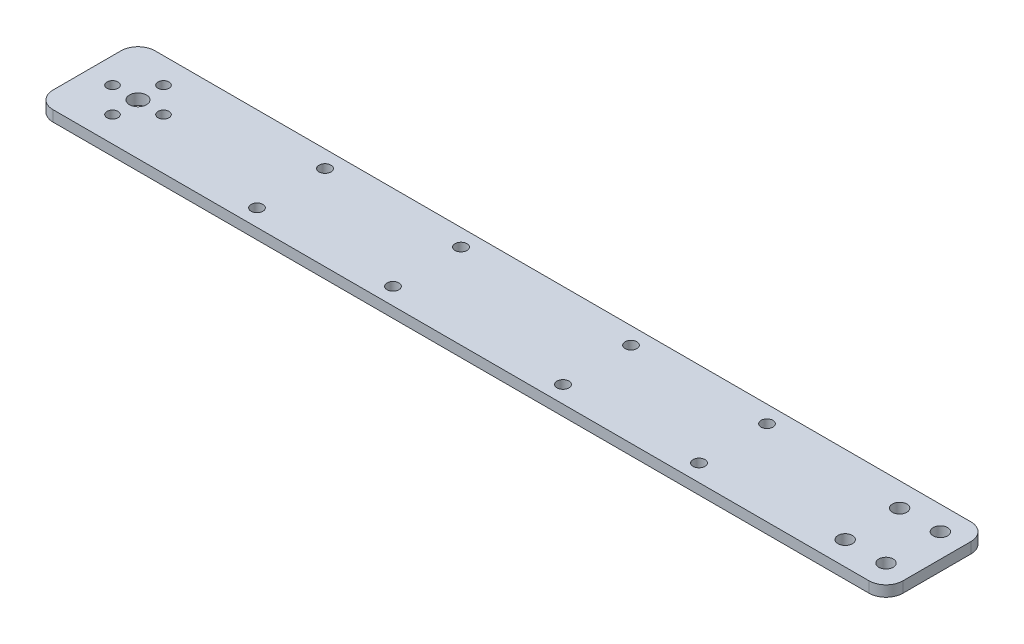
ISO-10303-21;
HEADER;
FILE_DESCRIPTION(('STEP AP214'),'2;1');
FILE_NAME('part.step','',(''),(''),'','','');
FILE_SCHEMA(('AUTOMOTIVE_DESIGN { 1 0 10303 214 1 1 1 1 }'));
ENDSEC;
DATA;
#1=APPLICATION_CONTEXT('core data for automotive mechanical design processes');
#2=APPLICATION_PROTOCOL_DEFINITION('international standard','automotive_design',2000,#1);
#3=PRODUCT_CONTEXT('',#1,'mechanical');
#4=PRODUCT('Part','Part','',(#3));
#5=PRODUCT_RELATED_PRODUCT_CATEGORY('part','',(#4));
#6=PRODUCT_DEFINITION_FORMATION('','',#4);
#7=PRODUCT_DEFINITION_CONTEXT('part definition',#1,'design');
#8=PRODUCT_DEFINITION('design','',#6,#7);
#9=PRODUCT_DEFINITION_SHAPE('','',#8);
#10=(LENGTH_UNIT() NAMED_UNIT(*) SI_UNIT(.MILLI.,.METRE.));
#11=(NAMED_UNIT(*) PLANE_ANGLE_UNIT() SI_UNIT($,.RADIAN.));
#12=(NAMED_UNIT(*) SI_UNIT($,.STERADIAN.) SOLID_ANGLE_UNIT());
#13=UNCERTAINTY_MEASURE_WITH_UNIT(LENGTH_MEASURE(1.E-05),#10,'distance_accuracy_value','');
#14=(GEOMETRIC_REPRESENTATION_CONTEXT(3) GLOBAL_UNCERTAINTY_ASSIGNED_CONTEXT((#13)) GLOBAL_UNIT_ASSIGNED_CONTEXT((#10,
#11,#12)) REPRESENTATION_CONTEXT('',''));
#15=CARTESIAN_POINT('',(0.,0.,0.));
#16=DIRECTION('',(0.,0.,1.));
#17=DIRECTION('',(1.,0.,0.));
#18=AXIS2_PLACEMENT_3D('',#15,#16,#17);
#19=CARTESIAN_POINT('',(-15.,3.175,-15.));
#20=DIRECTION('',(1.,0.,0.));
#21=DIRECTION('',(0.,0.,-1.));
#22=AXIS2_PLACEMENT_3D('',#19,#20,#21);
#23=PLANE('',#22);
#24=DIRECTION('',(0.,0.,1.));
#25=VECTOR('',#24,1.);
#26=CARTESIAN_POINT('',(-15.,3.175,-15.));
#27=LINE('',#26,#25);
#28=CARTESIAN_POINT('',(-15.,3.175,-10.));
#29=VERTEX_POINT('',#28);
#30=CARTESIAN_POINT('',(-15.,3.175,10.));
#31=VERTEX_POINT('',#30);
#32=EDGE_CURVE('E131',#29,#31,#27,.T.);
#33=ORIENTED_EDGE('',*,*,#32,.F.);
#34=DIRECTION('',(0.,-1.,0.));
#35=VECTOR('',#34,1.);
#36=CARTESIAN_POINT('',(-15.,3.175,-10.));
#37=LINE('',#36,#35);
#38=CARTESIAN_POINT('',(-15.,0.,-10.));
#39=VERTEX_POINT('',#38);
#40=EDGE_CURVE('E11',#29,#39,#37,.T.);
#41=ORIENTED_EDGE('',*,*,#40,.T.);
#42=DIRECTION('',(0.,0.,1.));
#43=VECTOR('',#42,1.);
#44=CARTESIAN_POINT('',(-15.,0.,-15.));
#45=LINE('',#44,#43);
#46=CARTESIAN_POINT('',(-15.,0.,10.));
#47=VERTEX_POINT('',#46);
#48=EDGE_CURVE('E133',#39,#47,#45,.T.);
#49=ORIENTED_EDGE('',*,*,#48,.T.);
#50=DIRECTION('',(0.,-1.,0.));
#51=VECTOR('',#50,1.);
#52=CARTESIAN_POINT('',(-15.,3.175,10.));
#53=LINE('',#52,#51);
#54=EDGE_CURVE('E43',#47,#31,#53,.F.);
#55=ORIENTED_EDGE('',*,*,#54,.T.);
#56=EDGE_LOOP('',(#33,#41,#49,#55));
#57=FACE_BOUND('',#56,.T.);
#58=ADVANCED_FACE('F34',(#57),#23,.F.);
#59=CARTESIAN_POINT('',(-15.,3.175,15.));
#60=DIRECTION('',(0.,0.,-1.));
#61=DIRECTION('',(-1.,0.,0.));
#62=AXIS2_PLACEMENT_3D('',#59,#60,#61);
#63=PLANE('',#62);
#64=DIRECTION('',(1.,0.,0.));
#65=VECTOR('',#64,1.);
#66=CARTESIAN_POINT('',(-15.,0.,15.));
#67=LINE('',#66,#65);
#68=CARTESIAN_POINT('',(-9.99999999999999,0.,15.));
#69=VERTEX_POINT('',#68);
#70=CARTESIAN_POINT('',(230.,0.,15.));
#71=VERTEX_POINT('',#70);
#72=EDGE_CURVE('E129',#69,#71,#67,.T.);
#73=ORIENTED_EDGE('',*,*,#72,.T.);
#74=DIRECTION('',(0.,-1.,0.));
#75=VECTOR('',#74,1.);
#76=CARTESIAN_POINT('',(230.,3.175,15.));
#77=LINE('',#76,#75);
#78=CARTESIAN_POINT('',(230.,3.175,15.));
#79=VERTEX_POINT('',#78);
#80=EDGE_CURVE('E108',#71,#79,#77,.F.);
#81=ORIENTED_EDGE('',*,*,#80,.T.);
#82=DIRECTION('',(1.,0.,0.));
#83=VECTOR('',#82,1.);
#84=CARTESIAN_POINT('',(-15.,3.175,15.));
#85=LINE('',#84,#83);
#86=CARTESIAN_POINT('',(-9.99999999999999,3.175,15.));
#87=VERTEX_POINT('',#86);
#88=EDGE_CURVE('E203',#87,#79,#85,.T.);
#89=ORIENTED_EDGE('',*,*,#88,.F.);
#90=DIRECTION('',(0.,-1.,0.));
#91=VECTOR('',#90,1.);
#92=CARTESIAN_POINT('',(-9.99999999999999,3.175,15.));
#93=LINE('',#92,#91);
#94=EDGE_CURVE('E113',#87,#69,#93,.T.);
#95=ORIENTED_EDGE('',*,*,#94,.T.);
#96=EDGE_LOOP('',(#73,#81,#89,#95));
#97=FACE_BOUND('',#96,.T.);
#98=ADVANCED_FACE('F219',(#97),#63,.F.);
#99=CARTESIAN_POINT('',(235.,3.175,-15.));
#100=DIRECTION('',(-1.,0.,0.));
#101=DIRECTION('',(0.,0.,1.));
#102=AXIS2_PLACEMENT_3D('',#99,#100,#101);
#103=PLANE('',#102);
#104=DIRECTION('',(0.,0.,-1.));
#105=VECTOR('',#104,1.);
#106=CARTESIAN_POINT('',(235.,3.175,-15.));
#107=LINE('',#106,#105);
#108=CARTESIAN_POINT('',(235.,3.175,10.));
#109=VERTEX_POINT('',#108);
#110=CARTESIAN_POINT('',(235.,3.175,-10.));
#111=VERTEX_POINT('',#110);
#112=EDGE_CURVE('E122',#109,#111,#107,.T.);
#113=ORIENTED_EDGE('',*,*,#112,.F.);
#114=DIRECTION('',(0.,-1.,0.));
#115=VECTOR('',#114,1.);
#116=CARTESIAN_POINT('',(235.,3.175,10.));
#117=LINE('',#116,#115);
#118=CARTESIAN_POINT('',(235.,0.,10.));
#119=VERTEX_POINT('',#118);
#120=EDGE_CURVE('E107',#109,#119,#117,.T.);
#121=ORIENTED_EDGE('',*,*,#120,.T.);
#122=DIRECTION('',(0.,0.,-1.));
#123=VECTOR('',#122,1.);
#124=CARTESIAN_POINT('',(235.,0.,-15.));
#125=LINE('',#124,#123);
#126=CARTESIAN_POINT('',(235.,0.,-10.));
#127=VERTEX_POINT('',#126);
#128=EDGE_CURVE('E120',#119,#127,#125,.T.);
#129=ORIENTED_EDGE('',*,*,#128,.T.);
#130=DIRECTION('',(0.,-1.,0.));
#131=VECTOR('',#130,1.);
#132=CARTESIAN_POINT('',(235.,3.175,-10.));
#133=LINE('',#132,#131);
#134=EDGE_CURVE('E124',#127,#111,#133,.F.);
#135=ORIENTED_EDGE('',*,*,#134,.T.);
#136=EDGE_LOOP('',(#113,#121,#129,#135));
#137=FACE_BOUND('',#136,.T.);
#138=ADVANCED_FACE('F119',(#137),#103,.F.);
#139=CARTESIAN_POINT('',(-15.,3.175,-15.));
#140=DIRECTION('',(0.,0.,1.));
#141=DIRECTION('',(1.,0.,0.));
#142=AXIS2_PLACEMENT_3D('',#139,#140,#141);
#143=PLANE('',#142);
#144=DIRECTION('',(-1.,0.,0.));
#145=VECTOR('',#144,1.);
#146=CARTESIAN_POINT('',(-15.,3.175,-15.));
#147=LINE('',#146,#145);
#148=CARTESIAN_POINT('',(230.,3.175,-15.));
#149=VERTEX_POINT('',#148);
#150=CARTESIAN_POINT('',(-9.99999999999999,3.175,-15.));
#151=VERTEX_POINT('',#150);
#152=EDGE_CURVE('E137',#149,#151,#147,.T.);
#153=ORIENTED_EDGE('',*,*,#152,.F.);
#154=DIRECTION('',(0.,-1.,0.));
#155=VECTOR('',#154,1.);
#156=CARTESIAN_POINT('',(230.,3.175,-15.));
#157=LINE('',#156,#155);
#158=CARTESIAN_POINT('',(230.,0.,-15.));
#159=VERTEX_POINT('',#158);
#160=EDGE_CURVE('E154',#149,#159,#157,.T.);
#161=ORIENTED_EDGE('',*,*,#160,.T.);
#162=DIRECTION('',(-1.,0.,0.));
#163=VECTOR('',#162,1.);
#164=CARTESIAN_POINT('',(-15.,0.,-15.));
#165=LINE('',#164,#163);
#166=CARTESIAN_POINT('',(-9.99999999999999,0.,-15.));
#167=VERTEX_POINT('',#166);
#168=EDGE_CURVE('E128',#159,#167,#165,.T.);
#169=ORIENTED_EDGE('',*,*,#168,.T.);
#170=DIRECTION('',(0.,-1.,0.));
#171=VECTOR('',#170,1.);
#172=CARTESIAN_POINT('',(-9.99999999999999,3.175,-15.));
#173=LINE('',#172,#171);
#174=EDGE_CURVE('E51',#167,#151,#173,.F.);
#175=ORIENTED_EDGE('',*,*,#174,.T.);
#176=EDGE_LOOP('',(#153,#161,#169,#175));
#177=FACE_BOUND('',#176,.T.);
#178=ADVANCED_FACE('F226',(#177),#143,.F.);
#179=CARTESIAN_POINT('',(0.,3.175,0.));
#180=DIRECTION('',(0.,1.,0.));
#181=DIRECTION('',(0.,0.,1.));
#182=AXIS2_PLACEMENT_3D('',#179,#180,#181);
#183=PLANE('',#182);
#184=CARTESIAN_POINT('',(216.,3.175,7.99999999999999));
#185=DIRECTION('',(0.,1.,0.));
#186=DIRECTION('',(0.,0.,-1.));
#187=AXIS2_PLACEMENT_3D('',#184,#185,#186);
#188=CIRCLE('',#187,2.12499999999998);
#189=CARTESIAN_POINT('',(216.,3.175,5.87500000000002));
#190=VERTEX_POINT('',#189);
#191=EDGE_CURVE('E344',#190,#190,#188,.T.);
#192=ORIENTED_EDGE('',*,*,#191,.F.);
#193=EDGE_LOOP('',(#192));
#194=FACE_BOUND('',#193,.T.);
#195=CARTESIAN_POINT('',(228.,3.175,7.99999999999999));
#196=DIRECTION('',(0.,1.,0.));
#197=DIRECTION('',(0.,0.,1.));
#198=AXIS2_PLACEMENT_3D('',#195,#196,#197);
#199=CIRCLE('',#198,2.12499999999998);
#200=CARTESIAN_POINT('',(228.,3.175,10.125));
#201=VERTEX_POINT('',#200);
#202=EDGE_CURVE('E336',#201,#201,#199,.T.);
#203=ORIENTED_EDGE('',*,*,#202,.F.);
#204=EDGE_LOOP('',(#203));
#205=FACE_BOUND('',#204,.T.);
#206=CARTESIAN_POINT('',(228.,3.175,-8.00000000000001));
#207=DIRECTION('',(0.,1.,0.));
#208=DIRECTION('',(0.,0.,-1.));
#209=AXIS2_PLACEMENT_3D('',#206,#207,#208);
#210=CIRCLE('',#209,2.12499999999998);
#211=CARTESIAN_POINT('',(228.,3.175,-10.125));
#212=VERTEX_POINT('',#211);
#213=EDGE_CURVE('E329',#212,#212,#210,.T.);
#214=ORIENTED_EDGE('',*,*,#213,.F.);
#215=EDGE_LOOP('',(#214));
#216=FACE_BOUND('',#215,.T.);
#217=CARTESIAN_POINT('',(216.,3.175,-8.00000000000001));
#218=DIRECTION('',(0.,1.,0.));
#219=DIRECTION('',(0.,0.,1.));
#220=AXIS2_PLACEMENT_3D('',#217,#218,#219);
#221=CIRCLE('',#220,2.12499999999998);
#222=CARTESIAN_POINT('',(216.,3.175,-5.87500000000003));
#223=VERTEX_POINT('',#222);
#224=EDGE_CURVE('E333',#223,#223,#221,.T.);
#225=ORIENTED_EDGE('',*,*,#224,.F.);
#226=EDGE_LOOP('',(#225));
#227=FACE_BOUND('',#226,.T.);
#228=CARTESIAN_POINT('',(175.,3.175,9.99999999999999));
#229=DIRECTION('',(0.,1.,0.));
#230=DIRECTION('',(0.,0.,1.));
#231=AXIS2_PLACEMENT_3D('',#228,#229,#230);
#232=CIRCLE('',#231,1.75000000000001);
#233=CARTESIAN_POINT('',(175.,3.175,11.75));
#234=VERTEX_POINT('',#233);
#235=EDGE_CURVE('E359',#234,#234,#232,.T.);
#236=ORIENTED_EDGE('',*,*,#235,.F.);
#237=EDGE_LOOP('',(#236));
#238=FACE_BOUND('',#237,.T.);
#239=CARTESIAN_POINT('',(85.,3.175,-9.99999999999999));
#240=DIRECTION('',(0.,1.,0.));
#241=DIRECTION('',(0.,0.,-1.));
#242=AXIS2_PLACEMENT_3D('',#239,#240,#241);
#243=CIRCLE('',#242,1.75);
#244=CARTESIAN_POINT('',(85.,3.175,-11.75));
#245=VERTEX_POINT('',#244);
#246=EDGE_CURVE('E362',#245,#245,#243,.T.);
#247=ORIENTED_EDGE('',*,*,#246,.F.);
#248=EDGE_LOOP('',(#247));
#249=FACE_BOUND('',#248,.T.);
#250=CARTESIAN_POINT('',(135.,3.175,-9.99999999999999));
#251=DIRECTION('',(0.,1.,0.));
#252=DIRECTION('',(0.,0.,1.));
#253=AXIS2_PLACEMENT_3D('',#250,#251,#252);
#254=CIRCLE('',#253,1.75000000000001);
#255=CARTESIAN_POINT('',(135.,3.175,-8.24999999999998));
#256=VERTEX_POINT('',#255);
#257=EDGE_CURVE('E365',#256,#256,#254,.T.);
#258=ORIENTED_EDGE('',*,*,#257,.F.);
#259=EDGE_LOOP('',(#258));
#260=FACE_BOUND('',#259,.T.);
#261=CARTESIAN_POINT('',(135.,3.175,9.99999999999999));
#262=DIRECTION('',(0.,1.,0.));
#263=DIRECTION('',(0.,0.,-1.));
#264=AXIS2_PLACEMENT_3D('',#261,#262,#263);
#265=CIRCLE('',#264,1.75000000000001);
#266=CARTESIAN_POINT('',(135.,3.175,8.24999999999998));
#267=VERTEX_POINT('',#266);
#268=EDGE_CURVE('E368',#267,#267,#265,.T.);
#269=ORIENTED_EDGE('',*,*,#268,.F.);
#270=EDGE_LOOP('',(#269));
#271=FACE_BOUND('',#270,.T.);
#272=CARTESIAN_POINT('',(45.,3.175,-9.99999999999999));
#273=DIRECTION('',(0.,1.,0.));
#274=DIRECTION('',(0.,0.,1.));
#275=AXIS2_PLACEMENT_3D('',#272,#273,#274);
#276=CIRCLE('',#275,1.75000000000001);
#277=CARTESIAN_POINT('',(45.,3.175,-8.24999999999998));
#278=VERTEX_POINT('',#277);
#279=EDGE_CURVE('E350',#278,#278,#276,.T.);
#280=ORIENTED_EDGE('',*,*,#279,.F.);
#281=EDGE_LOOP('',(#280));
#282=FACE_BOUND('',#281,.T.);
#283=CARTESIAN_POINT('',(45.,3.175,9.99999999999999));
#284=DIRECTION('',(0.,1.,0.));
#285=DIRECTION('',(0.,0.,-1.));
#286=AXIS2_PLACEMENT_3D('',#283,#284,#285);
#287=CIRCLE('',#286,1.75000000000001);
#288=CARTESIAN_POINT('',(45.,3.175,8.24999999999998));
#289=VERTEX_POINT('',#288);
#290=EDGE_CURVE('E355',#289,#289,#287,.T.);
#291=ORIENTED_EDGE('',*,*,#290,.F.);
#292=EDGE_LOOP('',(#291));
#293=FACE_BOUND('',#292,.T.);
#294=CARTESIAN_POINT('',(175.,3.175,-9.99999999999999));
#295=DIRECTION('',(0.,1.,0.));
#296=DIRECTION('',(0.,0.,-1.));
#297=AXIS2_PLACEMENT_3D('',#294,#295,#296);
#298=CIRCLE('',#297,1.75000000000001);
#299=CARTESIAN_POINT('',(175.,3.175,-11.75));
#300=VERTEX_POINT('',#299);
#301=EDGE_CURVE('E356',#300,#300,#298,.T.);
#302=ORIENTED_EDGE('',*,*,#301,.F.);
#303=EDGE_LOOP('',(#302));
#304=FACE_BOUND('',#303,.T.);
#305=CARTESIAN_POINT('',(85.,3.175,9.99999999999999));
#306=DIRECTION('',(0.,1.,0.));
#307=DIRECTION('',(0.,0.,1.));
#308=AXIS2_PLACEMENT_3D('',#305,#306,#307);
#309=CIRCLE('',#308,1.75);
#310=CARTESIAN_POINT('',(85.,3.175,11.75));
#311=VERTEX_POINT('',#310);
#312=EDGE_CURVE('E162',#311,#311,#309,.T.);
#313=ORIENTED_EDGE('',*,*,#312,.F.);
#314=EDGE_LOOP('',(#313));
#315=FACE_BOUND('',#314,.T.);
#316=CARTESIAN_POINT('',(7.5,3.175,0.));
#317=DIRECTION('',(0.,1.,0.));
#318=DIRECTION('',(0.,0.,1.));
#319=AXIS2_PLACEMENT_3D('',#316,#317,#318);
#320=CIRCLE('',#319,1.625);
#321=CARTESIAN_POINT('',(7.5,3.175,1.625));
#322=VERTEX_POINT('',#321);
#323=EDGE_CURVE('E377',#322,#322,#320,.T.);
#324=ORIENTED_EDGE('',*,*,#323,.F.);
#325=EDGE_LOOP('',(#324));
#326=FACE_BOUND('',#325,.T.);
#327=CARTESIAN_POINT('',(0.,3.175,7.5));
#328=DIRECTION('',(0.,1.,0.));
#329=DIRECTION('',(0.,0.,1.));
#330=AXIS2_PLACEMENT_3D('',#327,#328,#329);
#331=CIRCLE('',#330,1.625);
#332=CARTESIAN_POINT('',(0.,3.175,9.125));
#333=VERTEX_POINT('',#332);
#334=EDGE_CURVE('E383',#333,#333,#331,.T.);
#335=ORIENTED_EDGE('',*,*,#334,.F.);
#336=EDGE_LOOP('',(#335));
#337=FACE_BOUND('',#336,.T.);
#338=CARTESIAN_POINT('',(-7.5,3.175,0.));
#339=DIRECTION('',(0.,1.,0.));
#340=DIRECTION('',(0.,0.,1.));
#341=AXIS2_PLACEMENT_3D('',#338,#339,#340);
#342=CIRCLE('',#341,1.625);
#343=CARTESIAN_POINT('',(-7.5,3.175,1.62499999999995));
#344=VERTEX_POINT('',#343);
#345=EDGE_CURVE('E190',#344,#344,#342,.T.);
#346=ORIENTED_EDGE('',*,*,#345,.F.);
#347=EDGE_LOOP('',(#346));
#348=FACE_BOUND('',#347,.T.);
#349=CARTESIAN_POINT('',(0.,3.175,-7.5));
#350=DIRECTION('',(0.,1.,0.));
#351=DIRECTION('',(0.,0.,1.));
#352=AXIS2_PLACEMENT_3D('',#349,#350,#351);
#353=CIRCLE('',#352,1.625);
#354=CARTESIAN_POINT('',(0.,3.175,-5.875));
#355=VERTEX_POINT('',#354);
#356=EDGE_CURVE('E181',#355,#355,#353,.T.);
#357=ORIENTED_EDGE('',*,*,#356,.F.);
#358=EDGE_LOOP('',(#357));
#359=FACE_BOUND('',#358,.T.);
#360=CARTESIAN_POINT('',(0.,3.175,0.));
#361=DIRECTION('',(0.,1.,0.));
#362=DIRECTION('',(0.,0.,1.));
#363=AXIS2_PLACEMENT_3D('',#360,#361,#362);
#364=CIRCLE('',#363,2.5);
#365=CARTESIAN_POINT('',(0.,3.175,2.5));
#366=VERTEX_POINT('',#365);
#367=EDGE_CURVE('E197',#366,#366,#364,.T.);
#368=ORIENTED_EDGE('',*,*,#367,.F.);
#369=EDGE_LOOP('',(#368));
#370=FACE_BOUND('',#369,.T.);
#371=ORIENTED_EDGE('',*,*,#88,.T.);
#372=CARTESIAN_POINT('',(230.,3.175,10.));
#373=DIRECTION('',(0.,1.,0.));
#374=DIRECTION('',(0.,0.,1.));
#375=AXIS2_PLACEMENT_3D('',#372,#373,#374);
#376=CIRCLE('',#375,5.);
#377=EDGE_CURVE('E151',#79,#109,#376,.T.);
#378=ORIENTED_EDGE('',*,*,#377,.T.);
#379=ORIENTED_EDGE('',*,*,#112,.T.);
#380=CARTESIAN_POINT('',(230.,3.175,-10.));
#381=DIRECTION('',(0.,1.,0.));
#382=DIRECTION('',(0.,0.,1.));
#383=AXIS2_PLACEMENT_3D('',#380,#381,#382);
#384=CIRCLE('',#383,5.);
#385=EDGE_CURVE('E58',#111,#149,#384,.T.);
#386=ORIENTED_EDGE('',*,*,#385,.T.);
#387=ORIENTED_EDGE('',*,*,#152,.T.);
#388=CARTESIAN_POINT('',(-9.99999999999999,3.175,-10.));
#389=DIRECTION('',(0.,1.,0.));
#390=DIRECTION('',(0.,0.,1.));
#391=AXIS2_PLACEMENT_3D('',#388,#389,#390);
#392=CIRCLE('',#391,5.);
#393=EDGE_CURVE('E148',#151,#29,#392,.T.);
#394=ORIENTED_EDGE('',*,*,#393,.T.);
#395=ORIENTED_EDGE('',*,*,#32,.T.);
#396=CARTESIAN_POINT('',(-9.99999999999999,3.175,10.));
#397=DIRECTION('',(0.,1.,0.));
#398=DIRECTION('',(0.,0.,1.));
#399=AXIS2_PLACEMENT_3D('',#396,#397,#398);
#400=CIRCLE('',#399,5.);
#401=EDGE_CURVE('E146',#31,#87,#400,.T.);
#402=ORIENTED_EDGE('',*,*,#401,.T.);
#403=EDGE_LOOP('',(#371,#378,#379,#386,#387,#394,#395,#402));
#404=FACE_BOUND('',#403,.T.);
#405=ADVANCED_FACE('F217',(#194,#205,#216,#227,#238,#249,#260,#271,#282,#293,#304,#315,#326,
#337,#348,#359,#370,#404),#183,.T.);
#406=CARTESIAN_POINT('',(0.,0.,0.));
#407=DIRECTION('',(0.,1.,0.));
#408=DIRECTION('',(0.,0.,1.));
#409=AXIS2_PLACEMENT_3D('',#406,#407,#408);
#410=PLANE('',#409);
#411=CARTESIAN_POINT('',(216.,0.,7.99999999999999));
#412=DIRECTION('',(0.,1.,0.));
#413=DIRECTION('',(0.,0.,-1.));
#414=AXIS2_PLACEMENT_3D('',#411,#412,#413);
#415=CIRCLE('',#414,2.12499999999998);
#416=CARTESIAN_POINT('',(216.,0.,5.87500000000002));
#417=VERTEX_POINT('',#416);
#418=EDGE_CURVE('E341',#417,#417,#415,.T.);
#419=ORIENTED_EDGE('',*,*,#418,.T.);
#420=EDGE_LOOP('',(#419));
#421=FACE_BOUND('',#420,.T.);
#422=CARTESIAN_POINT('',(228.,0.,7.99999999999999));
#423=DIRECTION('',(0.,1.,0.));
#424=DIRECTION('',(0.,0.,1.));
#425=AXIS2_PLACEMENT_3D('',#422,#423,#424);
#426=CIRCLE('',#425,2.12499999999998);
#427=CARTESIAN_POINT('',(228.,0.,10.125));
#428=VERTEX_POINT('',#427);
#429=EDGE_CURVE('E331',#428,#428,#426,.T.);
#430=ORIENTED_EDGE('',*,*,#429,.T.);
#431=EDGE_LOOP('',(#430));
#432=FACE_BOUND('',#431,.T.);
#433=CARTESIAN_POINT('',(228.,0.,-8.00000000000001));
#434=DIRECTION('',(0.,1.,0.));
#435=DIRECTION('',(0.,0.,-1.));
#436=AXIS2_PLACEMENT_3D('',#433,#434,#435);
#437=CIRCLE('',#436,2.12499999999998);
#438=CARTESIAN_POINT('',(228.,0.,-10.125));
#439=VERTEX_POINT('',#438);
#440=EDGE_CURVE('E326',#439,#439,#437,.T.);
#441=ORIENTED_EDGE('',*,*,#440,.T.);
#442=EDGE_LOOP('',(#441));
#443=FACE_BOUND('',#442,.T.);
#444=CARTESIAN_POINT('',(216.,0.,-8.00000000000001));
#445=DIRECTION('',(0.,1.,0.));
#446=DIRECTION('',(0.,0.,1.));
#447=AXIS2_PLACEMENT_3D('',#444,#445,#446);
#448=CIRCLE('',#447,2.12499999999998);
#449=CARTESIAN_POINT('',(216.,0.,-5.87500000000003));
#450=VERTEX_POINT('',#449);
#451=EDGE_CURVE('E347',#450,#450,#448,.T.);
#452=ORIENTED_EDGE('',*,*,#451,.T.);
#453=EDGE_LOOP('',(#452));
#454=FACE_BOUND('',#453,.T.);
#455=CARTESIAN_POINT('',(175.,0.,9.99999999999999));
#456=DIRECTION('',(0.,1.,0.));
#457=DIRECTION('',(0.,0.,1.));
#458=AXIS2_PLACEMENT_3D('',#455,#456,#457);
#459=CIRCLE('',#458,1.75000000000001);
#460=CARTESIAN_POINT('',(175.,0.,11.75));
#461=VERTEX_POINT('',#460);
#462=EDGE_CURVE('E38',#461,#461,#459,.T.);
#463=ORIENTED_EDGE('',*,*,#462,.T.);
#464=EDGE_LOOP('',(#463));
#465=FACE_BOUND('',#464,.T.);
#466=CARTESIAN_POINT('',(85.,0.,-9.99999999999999));
#467=DIRECTION('',(0.,1.,0.));
#468=DIRECTION('',(0.,0.,1.));
#469=AXIS2_PLACEMENT_3D('',#466,#467,#468);
#470=CIRCLE('',#469,1.75);
#471=CARTESIAN_POINT('',(85.,0.,-8.25));
#472=VERTEX_POINT('',#471);
#473=EDGE_CURVE('E176',#472,#472,#470,.T.);
#474=ORIENTED_EDGE('',*,*,#473,.T.);
#475=EDGE_LOOP('',(#474));
#476=FACE_BOUND('',#475,.T.);
#477=CARTESIAN_POINT('',(135.,0.,-9.99999999999999));
#478=DIRECTION('',(0.,1.,0.));
#479=DIRECTION('',(0.,0.,1.));
#480=AXIS2_PLACEMENT_3D('',#477,#478,#479);
#481=CIRCLE('',#480,1.75000000000001);
#482=CARTESIAN_POINT('',(135.,0.,-8.24999999999998));
#483=VERTEX_POINT('',#482);
#484=EDGE_CURVE('E174',#483,#483,#481,.T.);
#485=ORIENTED_EDGE('',*,*,#484,.T.);
#486=EDGE_LOOP('',(#485));
#487=FACE_BOUND('',#486,.T.);
#488=CARTESIAN_POINT('',(135.,0.,9.99999999999999));
#489=DIRECTION('',(0.,1.,0.));
#490=DIRECTION('',(0.,0.,1.));
#491=AXIS2_PLACEMENT_3D('',#488,#489,#490);
#492=CIRCLE('',#491,1.75000000000001);
#493=CARTESIAN_POINT('',(135.,0.,11.75));
#494=VERTEX_POINT('',#493);
#495=EDGE_CURVE('E171',#494,#494,#492,.T.);
#496=ORIENTED_EDGE('',*,*,#495,.T.);
#497=EDGE_LOOP('',(#496));
#498=FACE_BOUND('',#497,.T.);
#499=CARTESIAN_POINT('',(45.,0.,-9.99999999999999));
#500=DIRECTION('',(0.,1.,0.));
#501=DIRECTION('',(0.,0.,1.));
#502=AXIS2_PLACEMENT_3D('',#499,#500,#501);
#503=CIRCLE('',#502,1.75000000000001);
#504=CARTESIAN_POINT('',(45.,0.,-8.24999999999998));
#505=VERTEX_POINT('',#504);
#506=EDGE_CURVE('E168',#505,#505,#503,.T.);
#507=ORIENTED_EDGE('',*,*,#506,.T.);
#508=EDGE_LOOP('',(#507));
#509=FACE_BOUND('',#508,.T.);
#510=CARTESIAN_POINT('',(45.,0.,9.99999999999999));
#511=DIRECTION('',(0.,1.,0.));
#512=DIRECTION('',(0.,0.,1.));
#513=AXIS2_PLACEMENT_3D('',#510,#511,#512);
#514=CIRCLE('',#513,1.75000000000001);
#515=CARTESIAN_POINT('',(45.,0.,11.75));
#516=VERTEX_POINT('',#515);
#517=EDGE_CURVE('E165',#516,#516,#514,.T.);
#518=ORIENTED_EDGE('',*,*,#517,.T.);
#519=EDGE_LOOP('',(#518));
#520=FACE_BOUND('',#519,.T.);
#521=CARTESIAN_POINT('',(175.,0.,-9.99999999999999));
#522=DIRECTION('',(0.,1.,0.));
#523=DIRECTION('',(0.,0.,1.));
#524=AXIS2_PLACEMENT_3D('',#521,#522,#523);
#525=CIRCLE('',#524,1.75000000000001);
#526=CARTESIAN_POINT('',(175.,0.,-8.24999999999998));
#527=VERTEX_POINT('',#526);
#528=EDGE_CURVE('E161',#527,#527,#525,.T.);
#529=ORIENTED_EDGE('',*,*,#528,.T.);
#530=EDGE_LOOP('',(#529));
#531=FACE_BOUND('',#530,.T.);
#532=CARTESIAN_POINT('',(85.,0.,9.99999999999999));
#533=DIRECTION('',(0.,1.,0.));
#534=DIRECTION('',(0.,0.,1.));
#535=AXIS2_PLACEMENT_3D('',#532,#533,#534);
#536=CIRCLE('',#535,1.75);
#537=CARTESIAN_POINT('',(85.,0.,11.75));
#538=VERTEX_POINT('',#537);
#539=EDGE_CURVE('E158',#538,#538,#536,.T.);
#540=ORIENTED_EDGE('',*,*,#539,.T.);
#541=EDGE_LOOP('',(#540));
#542=FACE_BOUND('',#541,.T.);
#543=CARTESIAN_POINT('',(7.5,0.,0.));
#544=DIRECTION('',(0.,1.,0.));
#545=DIRECTION('',(0.,0.,1.));
#546=AXIS2_PLACEMENT_3D('',#543,#544,#545);
#547=CIRCLE('',#546,1.625);
#548=CARTESIAN_POINT('',(7.5,0.,1.625));
#549=VERTEX_POINT('',#548);
#550=EDGE_CURVE('E200',#549,#549,#547,.T.);
#551=ORIENTED_EDGE('',*,*,#550,.T.);
#552=EDGE_LOOP('',(#551));
#553=FACE_BOUND('',#552,.T.);
#554=CARTESIAN_POINT('',(0.,0.,7.5));
#555=DIRECTION('',(0.,1.,0.));
#556=DIRECTION('',(0.,0.,1.));
#557=AXIS2_PLACEMENT_3D('',#554,#555,#556);
#558=CIRCLE('',#557,1.625);
#559=CARTESIAN_POINT('',(0.,0.,9.125));
#560=VERTEX_POINT('',#559);
#561=EDGE_CURVE('E380',#560,#560,#558,.T.);
#562=ORIENTED_EDGE('',*,*,#561,.T.);
#563=EDGE_LOOP('',(#562));
#564=FACE_BOUND('',#563,.T.);
#565=CARTESIAN_POINT('',(-7.5,0.,0.));
#566=DIRECTION('',(0.,1.,0.));
#567=DIRECTION('',(0.,0.,1.));
#568=AXIS2_PLACEMENT_3D('',#565,#566,#567);
#569=CIRCLE('',#568,1.625);
#570=CARTESIAN_POINT('',(-7.5,0.,1.62499999999995));
#571=VERTEX_POINT('',#570);
#572=EDGE_CURVE('E386',#571,#571,#569,.T.);
#573=ORIENTED_EDGE('',*,*,#572,.T.);
#574=EDGE_LOOP('',(#573));
#575=FACE_BOUND('',#574,.T.);
#576=CARTESIAN_POINT('',(0.,0.,-7.5));
#577=DIRECTION('',(0.,1.,0.));
#578=DIRECTION('',(0.,0.,1.));
#579=AXIS2_PLACEMENT_3D('',#576,#577,#578);
#580=CIRCLE('',#579,1.625);
#581=CARTESIAN_POINT('',(0.,0.,-5.875));
#582=VERTEX_POINT('',#581);
#583=EDGE_CURVE('E185',#582,#582,#580,.T.);
#584=ORIENTED_EDGE('',*,*,#583,.T.);
#585=EDGE_LOOP('',(#584));
#586=FACE_BOUND('',#585,.T.);
#587=CARTESIAN_POINT('',(0.,0.,0.));
#588=DIRECTION('',(0.,1.,0.));
#589=DIRECTION('',(0.,0.,1.));
#590=AXIS2_PLACEMENT_3D('',#587,#588,#589);
#591=CIRCLE('',#590,2.5);
#592=CARTESIAN_POINT('',(0.,0.,2.5));
#593=VERTEX_POINT('',#592);
#594=EDGE_CURVE('E194',#593,#593,#591,.T.);
#595=ORIENTED_EDGE('',*,*,#594,.T.);
#596=EDGE_LOOP('',(#595));
#597=FACE_BOUND('',#596,.T.);
#598=ORIENTED_EDGE('',*,*,#128,.F.);
#599=CARTESIAN_POINT('',(230.,0.,10.));
#600=DIRECTION('',(0.,1.,0.));
#601=DIRECTION('',(0.,0.,1.));
#602=AXIS2_PLACEMENT_3D('',#599,#600,#601);
#603=CIRCLE('',#602,5.);
#604=EDGE_CURVE('E103',#119,#71,#603,.F.);
#605=ORIENTED_EDGE('',*,*,#604,.T.);
#606=ORIENTED_EDGE('',*,*,#72,.F.);
#607=CARTESIAN_POINT('',(-9.99999999999999,0.,10.));
#608=DIRECTION('',(0.,1.,0.));
#609=DIRECTION('',(0.,0.,1.));
#610=AXIS2_PLACEMENT_3D('',#607,#608,#609);
#611=CIRCLE('',#610,5.);
#612=EDGE_CURVE('E123',#69,#47,#611,.F.);
#613=ORIENTED_EDGE('',*,*,#612,.T.);
#614=ORIENTED_EDGE('',*,*,#48,.F.);
#615=CARTESIAN_POINT('',(-9.99999999999999,0.,-10.));
#616=DIRECTION('',(0.,1.,0.));
#617=DIRECTION('',(0.,0.,1.));
#618=AXIS2_PLACEMENT_3D('',#615,#616,#617);
#619=CIRCLE('',#618,5.);
#620=EDGE_CURVE('E140',#39,#167,#619,.F.);
#621=ORIENTED_EDGE('',*,*,#620,.T.);
#622=ORIENTED_EDGE('',*,*,#168,.F.);
#623=CARTESIAN_POINT('',(230.,0.,-10.));
#624=DIRECTION('',(0.,1.,0.));
#625=DIRECTION('',(0.,0.,1.));
#626=AXIS2_PLACEMENT_3D('',#623,#624,#625);
#627=CIRCLE('',#626,5.);
#628=EDGE_CURVE('E114',#159,#127,#627,.F.);
#629=ORIENTED_EDGE('',*,*,#628,.T.);
#630=EDGE_LOOP('',(#598,#605,#606,#613,#614,#621,#622,#629));
#631=FACE_BOUND('',#630,.T.);
#632=ADVANCED_FACE('F126',(#421,#432,#443,#454,#465,#476,#487,#498,#509,#520,#531,#542,#553,
#564,#575,#586,#597,#631),#410,.F.);
#633=CARTESIAN_POINT('',(230.,3.175,10.));
#634=DIRECTION('',(0.,-1.,0.));
#635=DIRECTION('',(0.,0.,-1.));
#636=AXIS2_PLACEMENT_3D('',#633,#634,#635);
#637=CYLINDRICAL_SURFACE('',#636,5.);
#638=ORIENTED_EDGE('',*,*,#377,.F.);
#639=ORIENTED_EDGE('',*,*,#80,.F.);
#640=ORIENTED_EDGE('',*,*,#604,.F.);
#641=ORIENTED_EDGE('',*,*,#120,.F.);
#642=EDGE_LOOP('',(#638,#639,#640,#641));
#643=FACE_BOUND('',#642,.T.);
#644=ADVANCED_FACE('F106',(#643),#637,.T.);
#645=CARTESIAN_POINT('',(230.,3.175,-10.));
#646=DIRECTION('',(0.,-1.,0.));
#647=DIRECTION('',(0.,0.,-1.));
#648=AXIS2_PLACEMENT_3D('',#645,#646,#647);
#649=CYLINDRICAL_SURFACE('',#648,5.);
#650=ORIENTED_EDGE('',*,*,#385,.F.);
#651=ORIENTED_EDGE('',*,*,#134,.F.);
#652=ORIENTED_EDGE('',*,*,#628,.F.);
#653=ORIENTED_EDGE('',*,*,#160,.F.);
#654=EDGE_LOOP('',(#650,#651,#652,#653));
#655=FACE_BOUND('',#654,.T.);
#656=ADVANCED_FACE('F233',(#655),#649,.T.);
#657=CARTESIAN_POINT('',(-9.99999999999999,3.175,-10.));
#658=DIRECTION('',(0.,-1.,0.));
#659=DIRECTION('',(0.,0.,-1.));
#660=AXIS2_PLACEMENT_3D('',#657,#658,#659);
#661=CYLINDRICAL_SURFACE('',#660,5.);
#662=ORIENTED_EDGE('',*,*,#393,.F.);
#663=ORIENTED_EDGE('',*,*,#174,.F.);
#664=ORIENTED_EDGE('',*,*,#620,.F.);
#665=ORIENTED_EDGE('',*,*,#40,.F.);
#666=EDGE_LOOP('',(#662,#663,#664,#665));
#667=FACE_BOUND('',#666,.T.);
#668=ADVANCED_FACE('F235',(#667),#661,.T.);
#669=CARTESIAN_POINT('',(-9.99999999999999,3.175,10.));
#670=DIRECTION('',(0.,-1.,0.));
#671=DIRECTION('',(0.,0.,-1.));
#672=AXIS2_PLACEMENT_3D('',#669,#670,#671);
#673=CYLINDRICAL_SURFACE('',#672,5.);
#674=ORIENTED_EDGE('',*,*,#401,.F.);
#675=ORIENTED_EDGE('',*,*,#54,.F.);
#676=ORIENTED_EDGE('',*,*,#612,.F.);
#677=ORIENTED_EDGE('',*,*,#94,.F.);
#678=EDGE_LOOP('',(#674,#675,#676,#677));
#679=FACE_BOUND('',#678,.T.);
#680=ADVANCED_FACE('F36',(#679),#673,.T.);
#681=CARTESIAN_POINT('',(0.,0.,0.));
#682=DIRECTION('',(0.,1.,0.));
#683=DIRECTION('',(0.,0.,1.));
#684=AXIS2_PLACEMENT_3D('',#681,#682,#683);
#685=CYLINDRICAL_SURFACE('',#684,2.5);
#686=ORIENTED_EDGE('',*,*,#594,.F.);
#687=EDGE_LOOP('',(#686));
#688=FACE_BOUND('',#687,.T.);
#689=ORIENTED_EDGE('',*,*,#367,.T.);
#690=EDGE_LOOP('',(#689));
#691=FACE_BOUND('',#690,.T.);
#692=ADVANCED_FACE('F242',(#688,#691),#685,.F.);
#693=CARTESIAN_POINT('',(0.,0.,-7.5));
#694=DIRECTION('',(0.,1.,0.));
#695=DIRECTION('',(0.,0.,1.));
#696=AXIS2_PLACEMENT_3D('',#693,#694,#695);
#697=CYLINDRICAL_SURFACE('',#696,1.625);
#698=ORIENTED_EDGE('',*,*,#583,.F.);
#699=EDGE_LOOP('',(#698));
#700=FACE_BOUND('',#699,.T.);
#701=ORIENTED_EDGE('',*,*,#356,.T.);
#702=EDGE_LOOP('',(#701));
#703=FACE_BOUND('',#702,.T.);
#704=ADVANCED_FACE('F257',(#700,#703),#697,.F.);
#705=CARTESIAN_POINT('',(-7.5,0.,0.));
#706=DIRECTION('',(0.,1.,0.));
#707=DIRECTION('',(0.,0.,1.));
#708=AXIS2_PLACEMENT_3D('',#705,#706,#707);
#709=CYLINDRICAL_SURFACE('',#708,1.625);
#710=ORIENTED_EDGE('',*,*,#572,.F.);
#711=EDGE_LOOP('',(#710));
#712=FACE_BOUND('',#711,.T.);
#713=ORIENTED_EDGE('',*,*,#345,.T.);
#714=EDGE_LOOP('',(#713));
#715=FACE_BOUND('',#714,.T.);
#716=ADVANCED_FACE('F261',(#712,#715),#709,.F.);
#717=CARTESIAN_POINT('',(0.,0.,7.5));
#718=DIRECTION('',(0.,1.,0.));
#719=DIRECTION('',(0.,0.,1.));
#720=AXIS2_PLACEMENT_3D('',#717,#718,#719);
#721=CYLINDRICAL_SURFACE('',#720,1.625);
#722=ORIENTED_EDGE('',*,*,#561,.F.);
#723=EDGE_LOOP('',(#722));
#724=FACE_BOUND('',#723,.T.);
#725=ORIENTED_EDGE('',*,*,#334,.T.);
#726=EDGE_LOOP('',(#725));
#727=FACE_BOUND('',#726,.T.);
#728=ADVANCED_FACE('F265',(#724,#727),#721,.F.);
#729=CARTESIAN_POINT('',(7.5,0.,0.));
#730=DIRECTION('',(0.,1.,0.));
#731=DIRECTION('',(0.,0.,1.));
#732=AXIS2_PLACEMENT_3D('',#729,#730,#731);
#733=CYLINDRICAL_SURFACE('',#732,1.625);
#734=ORIENTED_EDGE('',*,*,#550,.F.);
#735=EDGE_LOOP('',(#734));
#736=FACE_BOUND('',#735,.T.);
#737=ORIENTED_EDGE('',*,*,#323,.T.);
#738=EDGE_LOOP('',(#737));
#739=FACE_BOUND('',#738,.T.);
#740=ADVANCED_FACE('F269',(#736,#739),#733,.F.);
#741=CARTESIAN_POINT('',(85.,-6.825,9.99999999999999));
#742=DIRECTION('',(0.,1.,0.));
#743=DIRECTION('',(0.,0.,1.));
#744=AXIS2_PLACEMENT_3D('',#741,#742,#743);
#745=CYLINDRICAL_SURFACE('',#744,1.75);
#746=ORIENTED_EDGE('',*,*,#312,.T.);
#747=EDGE_LOOP('',(#746));
#748=FACE_BOUND('',#747,.T.);
#749=ORIENTED_EDGE('',*,*,#539,.F.);
#750=EDGE_LOOP('',(#749));
#751=FACE_BOUND('',#750,.T.);
#752=ADVANCED_FACE('F273',(#748,#751),#745,.F.);
#753=CARTESIAN_POINT('',(175.,-6.825,-9.99999999999999));
#754=DIRECTION('',(0.,1.,0.));
#755=DIRECTION('',(0.,0.,1.));
#756=AXIS2_PLACEMENT_3D('',#753,#754,#755);
#757=CYLINDRICAL_SURFACE('',#756,1.75000000000001);
#758=ORIENTED_EDGE('',*,*,#301,.T.);
#759=EDGE_LOOP('',(#758));
#760=FACE_BOUND('',#759,.T.);
#761=ORIENTED_EDGE('',*,*,#528,.F.);
#762=EDGE_LOOP('',(#761));
#763=FACE_BOUND('',#762,.T.);
#764=ADVANCED_FACE('F277',(#760,#763),#757,.F.);
#765=CARTESIAN_POINT('',(45.,-6.825,9.99999999999999));
#766=DIRECTION('',(0.,1.,0.));
#767=DIRECTION('',(0.,0.,1.));
#768=AXIS2_PLACEMENT_3D('',#765,#766,#767);
#769=CYLINDRICAL_SURFACE('',#768,1.75000000000001);
#770=ORIENTED_EDGE('',*,*,#290,.T.);
#771=EDGE_LOOP('',(#770));
#772=FACE_BOUND('',#771,.T.);
#773=ORIENTED_EDGE('',*,*,#517,.F.);
#774=EDGE_LOOP('',(#773));
#775=FACE_BOUND('',#774,.T.);
#776=ADVANCED_FACE('F297',(#772,#775),#769,.F.);
#777=CARTESIAN_POINT('',(45.,-6.825,-9.99999999999999));
#778=DIRECTION('',(0.,1.,0.));
#779=DIRECTION('',(0.,0.,1.));
#780=AXIS2_PLACEMENT_3D('',#777,#778,#779);
#781=CYLINDRICAL_SURFACE('',#780,1.75000000000001);
#782=ORIENTED_EDGE('',*,*,#279,.T.);
#783=EDGE_LOOP('',(#782));
#784=FACE_BOUND('',#783,.T.);
#785=ORIENTED_EDGE('',*,*,#506,.F.);
#786=EDGE_LOOP('',(#785));
#787=FACE_BOUND('',#786,.T.);
#788=ADVANCED_FACE('F287',(#784,#787),#781,.F.);
#789=CARTESIAN_POINT('',(135.,-6.825,9.99999999999999));
#790=DIRECTION('',(0.,1.,0.));
#791=DIRECTION('',(0.,0.,1.));
#792=AXIS2_PLACEMENT_3D('',#789,#790,#791);
#793=CYLINDRICAL_SURFACE('',#792,1.75000000000001);
#794=ORIENTED_EDGE('',*,*,#268,.T.);
#795=EDGE_LOOP('',(#794));
#796=FACE_BOUND('',#795,.T.);
#797=ORIENTED_EDGE('',*,*,#495,.F.);
#798=EDGE_LOOP('',(#797));
#799=FACE_BOUND('',#798,.T.);
#800=ADVANCED_FACE('F283',(#796,#799),#793,.F.);
#801=CARTESIAN_POINT('',(135.,-6.825,-9.99999999999999));
#802=DIRECTION('',(0.,1.,0.));
#803=DIRECTION('',(0.,0.,1.));
#804=AXIS2_PLACEMENT_3D('',#801,#802,#803);
#805=CYLINDRICAL_SURFACE('',#804,1.75000000000001);
#806=ORIENTED_EDGE('',*,*,#257,.T.);
#807=EDGE_LOOP('',(#806));
#808=FACE_BOUND('',#807,.T.);
#809=ORIENTED_EDGE('',*,*,#484,.F.);
#810=EDGE_LOOP('',(#809));
#811=FACE_BOUND('',#810,.T.);
#812=ADVANCED_FACE('F279',(#808,#811),#805,.F.);
#813=CARTESIAN_POINT('',(85.,-6.825,-9.99999999999999));
#814=DIRECTION('',(0.,1.,0.));
#815=DIRECTION('',(0.,0.,1.));
#816=AXIS2_PLACEMENT_3D('',#813,#814,#815);
#817=CYLINDRICAL_SURFACE('',#816,1.75);
#818=ORIENTED_EDGE('',*,*,#246,.T.);
#819=EDGE_LOOP('',(#818));
#820=FACE_BOUND('',#819,.T.);
#821=ORIENTED_EDGE('',*,*,#473,.F.);
#822=EDGE_LOOP('',(#821));
#823=FACE_BOUND('',#822,.T.);
#824=ADVANCED_FACE('F282',(#820,#823),#817,.F.);
#825=CARTESIAN_POINT('',(175.,-6.825,9.99999999999999));
#826=DIRECTION('',(0.,1.,0.));
#827=DIRECTION('',(0.,0.,1.));
#828=AXIS2_PLACEMENT_3D('',#825,#826,#827);
#829=CYLINDRICAL_SURFACE('',#828,1.75000000000001);
#830=ORIENTED_EDGE('',*,*,#235,.T.);
#831=EDGE_LOOP('',(#830));
#832=FACE_BOUND('',#831,.T.);
#833=ORIENTED_EDGE('',*,*,#462,.F.);
#834=EDGE_LOOP('',(#833));
#835=FACE_BOUND('',#834,.T.);
#836=ADVANCED_FACE('F289',(#832,#835),#829,.F.);
#837=CARTESIAN_POINT('',(216.,0.,-8.00000000000001));
#838=DIRECTION('',(0.,1.,0.));
#839=DIRECTION('',(0.,0.,1.));
#840=AXIS2_PLACEMENT_3D('',#837,#838,#839);
#841=CYLINDRICAL_SURFACE('',#840,2.12499999999998);
#842=ORIENTED_EDGE('',*,*,#451,.F.);
#843=EDGE_LOOP('',(#842));
#844=FACE_BOUND('',#843,.T.);
#845=ORIENTED_EDGE('',*,*,#224,.T.);
#846=EDGE_LOOP('',(#845));
#847=FACE_BOUND('',#846,.T.);
#848=ADVANCED_FACE('F292',(#844,#847),#841,.F.);
#849=CARTESIAN_POINT('',(228.,0.,-8.00000000000001));
#850=DIRECTION('',(0.,1.,0.));
#851=DIRECTION('',(0.,0.,1.));
#852=AXIS2_PLACEMENT_3D('',#849,#850,#851);
#853=CYLINDRICAL_SURFACE('',#852,2.12499999999998);
#854=ORIENTED_EDGE('',*,*,#440,.F.);
#855=EDGE_LOOP('',(#854));
#856=FACE_BOUND('',#855,.T.);
#857=ORIENTED_EDGE('',*,*,#213,.T.);
#858=EDGE_LOOP('',(#857));
#859=FACE_BOUND('',#858,.T.);
#860=ADVANCED_FACE('F309',(#856,#859),#853,.F.);
#861=CARTESIAN_POINT('',(228.,0.,7.99999999999999));
#862=DIRECTION('',(0.,1.,0.));
#863=DIRECTION('',(0.,0.,1.));
#864=AXIS2_PLACEMENT_3D('',#861,#862,#863);
#865=CYLINDRICAL_SURFACE('',#864,2.12499999999998);
#866=ORIENTED_EDGE('',*,*,#429,.F.);
#867=EDGE_LOOP('',(#866));
#868=FACE_BOUND('',#867,.T.);
#869=ORIENTED_EDGE('',*,*,#202,.T.);
#870=EDGE_LOOP('',(#869));
#871=FACE_BOUND('',#870,.T.);
#872=ADVANCED_FACE('F314',(#868,#871),#865,.F.);
#873=CARTESIAN_POINT('',(216.,0.,7.99999999999999));
#874=DIRECTION('',(0.,1.,0.));
#875=DIRECTION('',(0.,0.,1.));
#876=AXIS2_PLACEMENT_3D('',#873,#874,#875);
#877=CYLINDRICAL_SURFACE('',#876,2.12499999999998);
#878=ORIENTED_EDGE('',*,*,#418,.F.);
#879=EDGE_LOOP('',(#878));
#880=FACE_BOUND('',#879,.T.);
#881=ORIENTED_EDGE('',*,*,#191,.T.);
#882=EDGE_LOOP('',(#881));
#883=FACE_BOUND('',#882,.T.);
#884=ADVANCED_FACE('F311',(#880,#883),#877,.F.);
#885=CLOSED_SHELL('',(#58,#98,#138,#178,#405,#632,#644,#656,#668,#680,#692,#704,#716,#728,#740,
#752,#764,#776,#788,#800,#812,#824,#836,#848,#860,#872,#884));
#886=MANIFOLD_SOLID_BREP('B2',#885);
#887=ADVANCED_BREP_SHAPE_REPRESENTATION('',(#18,#886),#14);
#888=SHAPE_DEFINITION_REPRESENTATION(#9,#887);
ENDSEC;
END-ISO-10303-21;
